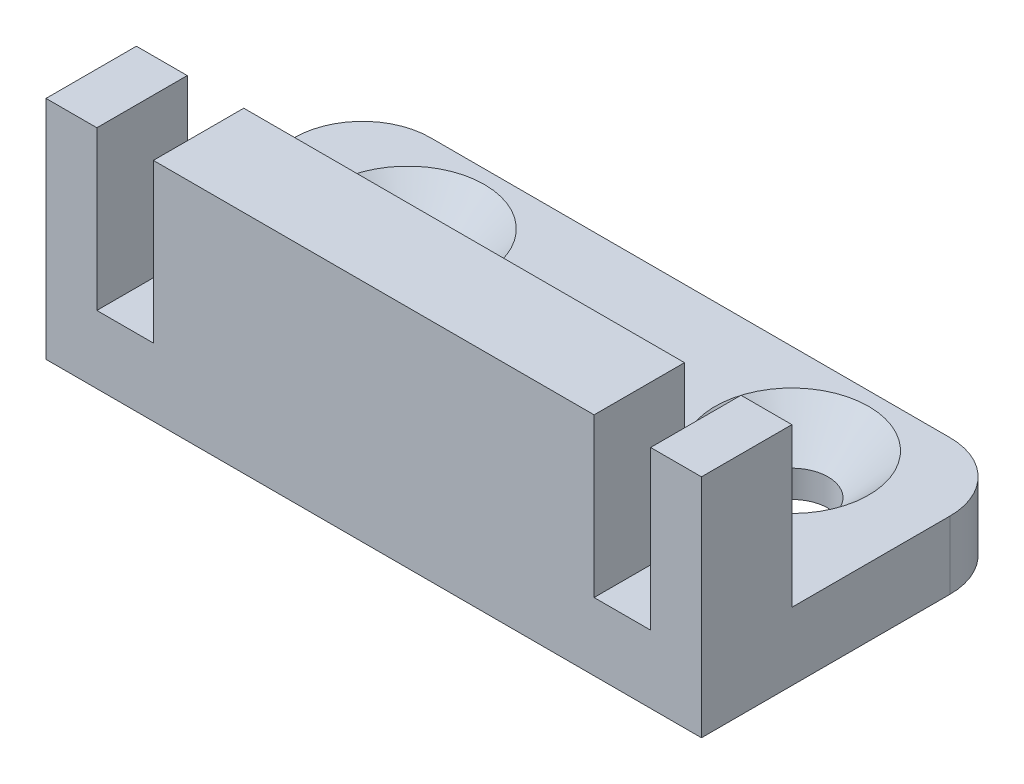
ISO-10303-21;
HEADER;
FILE_DESCRIPTION(('STEP AP214'),'2;1');
FILE_NAME('part.step','',(''),(''),'','','');
FILE_SCHEMA(('AUTOMOTIVE_DESIGN { 1 0 10303 214 1 1 1 1 }'));
ENDSEC;
DATA;
#1=APPLICATION_CONTEXT('core data for automotive mechanical design processes');
#2=APPLICATION_PROTOCOL_DEFINITION('international standard','automotive_design',2000,#1);
#3=PRODUCT_CONTEXT('',#1,'mechanical');
#4=PRODUCT('Part','Part','',(#3));
#5=PRODUCT_RELATED_PRODUCT_CATEGORY('part','',(#4));
#6=PRODUCT_DEFINITION_FORMATION('','',#4);
#7=PRODUCT_DEFINITION_CONTEXT('part definition',#1,'design');
#8=PRODUCT_DEFINITION('design','',#6,#7);
#9=PRODUCT_DEFINITION_SHAPE('','',#8);
#10=(LENGTH_UNIT() NAMED_UNIT(*) SI_UNIT(.MILLI.,.METRE.));
#11=(NAMED_UNIT(*) PLANE_ANGLE_UNIT() SI_UNIT($,.RADIAN.));
#12=(NAMED_UNIT(*) SI_UNIT($,.STERADIAN.) SOLID_ANGLE_UNIT());
#13=UNCERTAINTY_MEASURE_WITH_UNIT(LENGTH_MEASURE(1.E-05),#10,'distance_accuracy_value','');
#14=(GEOMETRIC_REPRESENTATION_CONTEXT(3) GLOBAL_UNCERTAINTY_ASSIGNED_CONTEXT((#13)) GLOBAL_UNIT_ASSIGNED_CONTEXT((#10,
#11,#12)) REPRESENTATION_CONTEXT('',''));
#15=CARTESIAN_POINT('',(0.,0.,0.));
#16=DIRECTION('',(0.,0.,1.));
#17=DIRECTION('',(1.,0.,0.));
#18=AXIS2_PLACEMENT_3D('',#15,#16,#17);
#19=CARTESIAN_POINT('',(0.,0.,-4.));
#20=DIRECTION('',(0.,0.,1.));
#21=DIRECTION('',(-1.,0.,0.));
#22=AXIS2_PLACEMENT_3D('',#19,#20,#21);
#23=PLANE('',#22);
#24=DIRECTION('',(-1.,0.,0.));
#25=VECTOR('',#24,1.);
#26=CARTESIAN_POINT('',(0.,3.,-4.));
#27=LINE('',#26,#25);
#28=CARTESIAN_POINT('',(2.25,3.,-4.));
#29=VERTEX_POINT('',#28);
#30=CARTESIAN_POINT('',(0.,3.,-4.));
#31=VERTEX_POINT('',#30);
#32=EDGE_CURVE('E152',#29,#31,#27,.T.);
#33=ORIENTED_EDGE('',*,*,#32,.T.);
#34=DIRECTION('',(0.,-1.,0.));
#35=VECTOR('',#34,1.);
#36=CARTESIAN_POINT('',(0.,0.,-4.));
#37=LINE('',#36,#35);
#38=CARTESIAN_POINT('',(0.,10.,-4.));
#39=VERTEX_POINT('',#38);
#40=EDGE_CURVE('E214',#39,#31,#37,.T.);
#41=ORIENTED_EDGE('',*,*,#40,.F.);
#42=DIRECTION('',(-1.,0.,0.));
#43=VECTOR('',#42,1.);
#44=CARTESIAN_POINT('',(0.,10.,-4.));
#45=LINE('',#44,#43);
#46=CARTESIAN_POINT('',(2.25,10.,-4.));
#47=VERTEX_POINT('',#46);
#48=EDGE_CURVE('E221',#47,#39,#45,.T.);
#49=ORIENTED_EDGE('',*,*,#48,.F.);
#50=DIRECTION('',(0.,1.,0.));
#51=VECTOR('',#50,1.);
#52=CARTESIAN_POINT('',(2.25,-1.7169905660283,-4.));
#53=LINE('',#52,#51);
#54=EDGE_CURVE('E157',#29,#47,#53,.T.);
#55=ORIENTED_EDGE('',*,*,#54,.F.);
#56=EDGE_LOOP('',(#33,#41,#49,#55));
#57=FACE_BOUND('',#56,.T.);
#58=ADVANCED_FACE('F35',(#57),#23,.F.);
#59=CARTESIAN_POINT('',(29.,10.,-4.));
#60=VERTEX_POINT('',#59);
#61=CARTESIAN_POINT('',(26.75,10.,-4.));
#62=VERTEX_POINT('',#61);
#63=EDGE_CURVE('E222',#60,#62,#45,.T.);
#64=ORIENTED_EDGE('',*,*,#63,.F.);
#65=DIRECTION('',(0.,1.,0.));
#66=VECTOR('',#65,1.);
#67=CARTESIAN_POINT('',(29.,0.,-4.));
#68=LINE('',#67,#66);
#69=CARTESIAN_POINT('',(29.,3.,-4.));
#70=VERTEX_POINT('',#69);
#71=EDGE_CURVE('E217',#70,#60,#68,.T.);
#72=ORIENTED_EDGE('',*,*,#71,.F.);
#73=CARTESIAN_POINT('',(26.75,3.,-4.));
#74=VERTEX_POINT('',#73);
#75=EDGE_CURVE('E204',#70,#74,#27,.T.);
#76=ORIENTED_EDGE('',*,*,#75,.T.);
#77=DIRECTION('',(0.,1.,0.));
#78=VECTOR('',#77,1.);
#79=CARTESIAN_POINT('',(26.75,-1.7169905660283,-4.));
#80=LINE('',#79,#78);
#81=EDGE_CURVE('E179',#74,#62,#80,.T.);
#82=ORIENTED_EDGE('',*,*,#81,.T.);
#83=EDGE_LOOP('',(#64,#72,#76,#82));
#84=FACE_BOUND('',#83,.T.);
#85=ADVANCED_FACE('F336',(#84),#23,.F.);
#86=CARTESIAN_POINT('',(0.,10.,-4.));
#87=DIRECTION('',(0.,-1.,0.));
#88=DIRECTION('',(0.,0.,1.));
#89=AXIS2_PLACEMENT_3D('',#86,#87,#88);
#90=PLANE('',#89);
#91=ORIENTED_EDGE('',*,*,#48,.T.);
#92=DIRECTION('',(0.,0.,1.));
#93=VECTOR('',#92,1.);
#94=CARTESIAN_POINT('',(0.,10.,-4.));
#95=LINE('',#94,#93);
#96=CARTESIAN_POINT('',(0.,10.,0.));
#97=VERTEX_POINT('',#96);
#98=EDGE_CURVE('E225',#39,#97,#95,.T.);
#99=ORIENTED_EDGE('',*,*,#98,.T.);
#100=DIRECTION('',(-1.,0.,0.));
#101=VECTOR('',#100,1.);
#102=CARTESIAN_POINT('',(0.,10.,0.));
#103=LINE('',#102,#101);
#104=CARTESIAN_POINT('',(2.25,10.,0.));
#105=VERTEX_POINT('',#104);
#106=EDGE_CURVE('E234',#105,#97,#103,.T.);
#107=ORIENTED_EDGE('',*,*,#106,.F.);
#108=DIRECTION('',(0.,0.,-1.));
#109=VECTOR('',#108,1.);
#110=CARTESIAN_POINT('',(2.25,10.,0.));
#111=LINE('',#110,#109);
#112=EDGE_CURVE('E166',#105,#47,#111,.T.);
#113=ORIENTED_EDGE('',*,*,#112,.T.);
#114=EDGE_LOOP('',(#91,#99,#107,#113));
#115=FACE_BOUND('',#114,.T.);
#116=ADVANCED_FACE('F341',(#115),#90,.F.);
#117=CARTESIAN_POINT('',(29.,10.,0.));
#118=VERTEX_POINT('',#117);
#119=CARTESIAN_POINT('',(26.75,10.,0.));
#120=VERTEX_POINT('',#119);
#121=EDGE_CURVE('E218',#118,#120,#103,.T.);
#122=ORIENTED_EDGE('',*,*,#121,.F.);
#123=DIRECTION('',(0.,0.,1.));
#124=VECTOR('',#123,1.);
#125=CARTESIAN_POINT('',(29.,10.,-4.));
#126=LINE('',#125,#124);
#127=EDGE_CURVE('E240',#60,#118,#126,.T.);
#128=ORIENTED_EDGE('',*,*,#127,.F.);
#129=ORIENTED_EDGE('',*,*,#63,.T.);
#130=DIRECTION('',(0.,0.,1.));
#131=VECTOR('',#130,1.);
#132=CARTESIAN_POINT('',(26.75,10.,0.));
#133=LINE('',#132,#131);
#134=EDGE_CURVE('E176',#62,#120,#133,.T.);
#135=ORIENTED_EDGE('',*,*,#134,.T.);
#136=EDGE_LOOP('',(#122,#128,#129,#135));
#137=FACE_BOUND('',#136,.T.);
#138=ADVANCED_FACE('F346',(#137),#90,.F.);
#139=CARTESIAN_POINT('',(24.25,10.,-4.));
#140=VERTEX_POINT('',#139);
#141=CARTESIAN_POINT('',(4.75,10.,-4.));
#142=VERTEX_POINT('',#141);
#143=EDGE_CURVE('E226',#140,#142,#45,.T.);
#144=ORIENTED_EDGE('',*,*,#143,.F.);
#145=DIRECTION('',(0.,1.,0.));
#146=VECTOR('',#145,1.);
#147=CARTESIAN_POINT('',(24.25,-1.7169905660283,-4.));
#148=LINE('',#147,#146);
#149=CARTESIAN_POINT('',(24.25,3.,-4.));
#150=VERTEX_POINT('',#149);
#151=EDGE_CURVE('E185',#150,#140,#148,.T.);
#152=ORIENTED_EDGE('',*,*,#151,.F.);
#153=CARTESIAN_POINT('',(4.75,3.,-4.));
#154=VERTEX_POINT('',#153);
#155=EDGE_CURVE('E209',#150,#154,#27,.T.);
#156=ORIENTED_EDGE('',*,*,#155,.T.);
#157=DIRECTION('',(0.,1.,0.));
#158=VECTOR('',#157,1.);
#159=CARTESIAN_POINT('',(4.75,-1.7169905660283,-4.));
#160=LINE('',#159,#158);
#161=EDGE_CURVE('E300',#154,#142,#160,.T.);
#162=ORIENTED_EDGE('',*,*,#161,.T.);
#163=EDGE_LOOP('',(#144,#152,#156,#162));
#164=FACE_BOUND('',#163,.T.);
#165=ADVANCED_FACE('F298',(#164),#23,.F.);
#166=CARTESIAN_POINT('',(0.,0.,-4.));
#167=DIRECTION('',(1.,0.,0.));
#168=DIRECTION('',(0.,0.,1.));
#169=AXIS2_PLACEMENT_3D('',#166,#167,#168);
#170=PLANE('',#169);
#171=DIRECTION('',(0.,0.,1.));
#172=VECTOR('',#171,1.);
#173=CARTESIAN_POINT('',(0.,0.,-4.));
#174=LINE('',#173,#172);
#175=CARTESIAN_POINT('',(0.,0.,-11.));
#176=VERTEX_POINT('',#175);
#177=CARTESIAN_POINT('',(0.,0.,0.));
#178=VERTEX_POINT('',#177);
#179=EDGE_CURVE('E246',#176,#178,#174,.T.);
#180=ORIENTED_EDGE('',*,*,#179,.T.);
#181=DIRECTION('',(0.,-1.,0.));
#182=VECTOR('',#181,1.);
#183=CARTESIAN_POINT('',(0.,0.,0.));
#184=LINE('',#183,#182);
#185=EDGE_CURVE('E213',#97,#178,#184,.T.);
#186=ORIENTED_EDGE('',*,*,#185,.F.);
#187=ORIENTED_EDGE('',*,*,#98,.F.);
#188=ORIENTED_EDGE('',*,*,#40,.T.);
#189=DIRECTION('',(0.,0.,1.));
#190=VECTOR('',#189,1.);
#191=CARTESIAN_POINT('',(0.,3.,-14.));
#192=LINE('',#191,#190);
#193=CARTESIAN_POINT('',(0.,3.,-11.));
#194=VERTEX_POINT('',#193);
#195=EDGE_CURVE('E206',#194,#31,#192,.T.);
#196=ORIENTED_EDGE('',*,*,#195,.F.);
#197=DIRECTION('',(0.,-1.,0.));
#198=VECTOR('',#197,1.);
#199=CARTESIAN_POINT('',(0.,0.,-11.));
#200=LINE('',#199,#198);
#201=EDGE_CURVE('E270',#176,#194,#200,.F.);
#202=ORIENTED_EDGE('',*,*,#201,.F.);
#203=EDGE_LOOP('',(#180,#186,#187,#188,#196,#202));
#204=FACE_BOUND('',#203,.T.);
#205=ADVANCED_FACE('F287',(#204),#170,.F.);
#206=CARTESIAN_POINT('',(0.,0.,-4.));
#207=DIRECTION('',(0.,1.,0.));
#208=DIRECTION('',(0.,0.,-1.));
#209=AXIS2_PLACEMENT_3D('',#206,#207,#208);
#210=PLANE('',#209);
#211=CARTESIAN_POINT('',(6.,0.,-10.));
#212=DIRECTION('',(0.,-1.,0.));
#213=DIRECTION('',(0.,0.,-1.));
#214=AXIS2_PLACEMENT_3D('',#211,#212,#213);
#215=CIRCLE('',#214,1.6);
#216=CARTESIAN_POINT('',(6.,0.,-11.6));
#217=VERTEX_POINT('',#216);
#218=EDGE_CURVE('E182',#217,#217,#215,.F.);
#219=ORIENTED_EDGE('',*,*,#218,.T.);
#220=EDGE_LOOP('',(#219));
#221=FACE_BOUND('',#220,.T.);
#222=CARTESIAN_POINT('',(23.,0.,-10.));
#223=DIRECTION('',(0.,-1.,0.));
#224=DIRECTION('',(0.,0.,-1.));
#225=AXIS2_PLACEMENT_3D('',#222,#223,#224);
#226=CIRCLE('',#225,1.6);
#227=CARTESIAN_POINT('',(23.,0.,-11.6));
#228=VERTEX_POINT('',#227);
#229=EDGE_CURVE('E311',#228,#228,#226,.F.);
#230=ORIENTED_EDGE('',*,*,#229,.T.);
#231=EDGE_LOOP('',(#230));
#232=FACE_BOUND('',#231,.T.);
#233=DIRECTION('',(1.,0.,0.));
#234=VECTOR('',#233,1.);
#235=CARTESIAN_POINT('',(0.,0.,-14.));
#236=LINE('',#235,#234);
#237=CARTESIAN_POINT('',(3.,0.,-14.));
#238=VERTEX_POINT('',#237);
#239=CARTESIAN_POINT('',(26.,0.,-14.));
#240=VERTEX_POINT('',#239);
#241=EDGE_CURVE('E200',#238,#240,#236,.T.);
#242=ORIENTED_EDGE('',*,*,#241,.T.);
#243=CARTESIAN_POINT('',(26.,0.,-11.));
#244=DIRECTION('',(0.,-1.,0.));
#245=DIRECTION('',(0.,0.,-1.));
#246=AXIS2_PLACEMENT_3D('',#243,#244,#245);
#247=CIRCLE('',#246,3.);
#248=CARTESIAN_POINT('',(29.,0.,-11.));
#249=VERTEX_POINT('',#248);
#250=EDGE_CURVE('E265',#249,#240,#247,.F.);
#251=ORIENTED_EDGE('',*,*,#250,.F.);
#252=DIRECTION('',(0.,0.,1.));
#253=VECTOR('',#252,1.);
#254=CARTESIAN_POINT('',(29.,0.,-4.));
#255=LINE('',#254,#253);
#256=CARTESIAN_POINT('',(29.,0.,0.));
#257=VERTEX_POINT('',#256);
#258=EDGE_CURVE('E243',#249,#257,#255,.T.);
#259=ORIENTED_EDGE('',*,*,#258,.T.);
#260=DIRECTION('',(1.,0.,0.));
#261=VECTOR('',#260,1.);
#262=CARTESIAN_POINT('',(0.,0.,0.));
#263=LINE('',#262,#261);
#264=EDGE_CURVE('E229',#178,#257,#263,.T.);
#265=ORIENTED_EDGE('',*,*,#264,.F.);
#266=ORIENTED_EDGE('',*,*,#179,.F.);
#267=CARTESIAN_POINT('',(3.,0.,-11.));
#268=DIRECTION('',(0.,-1.,0.));
#269=DIRECTION('',(0.,0.,-1.));
#270=AXIS2_PLACEMENT_3D('',#267,#268,#269);
#271=CIRCLE('',#270,3.);
#272=EDGE_CURVE('E268',#238,#176,#271,.F.);
#273=ORIENTED_EDGE('',*,*,#272,.F.);
#274=EDGE_LOOP('',(#242,#251,#259,#265,#266,#273));
#275=FACE_BOUND('',#274,.T.);
#276=ADVANCED_FACE('F284',(#221,#232,#275),#210,.F.);
#277=CARTESIAN_POINT('',(29.,0.,-4.));
#278=DIRECTION('',(-1.,0.,0.));
#279=DIRECTION('',(0.,0.,-1.));
#280=AXIS2_PLACEMENT_3D('',#277,#278,#279);
#281=PLANE('',#280);
#282=DIRECTION('',(0.,0.,1.));
#283=VECTOR('',#282,1.);
#284=CARTESIAN_POINT('',(29.,3.,-14.));
#285=LINE('',#284,#283);
#286=CARTESIAN_POINT('',(29.,3.,-11.));
#287=VERTEX_POINT('',#286);
#288=EDGE_CURVE('E211',#287,#70,#285,.T.);
#289=ORIENTED_EDGE('',*,*,#288,.T.);
#290=ORIENTED_EDGE('',*,*,#71,.T.);
#291=ORIENTED_EDGE('',*,*,#127,.T.);
#292=DIRECTION('',(0.,1.,0.));
#293=VECTOR('',#292,1.);
#294=CARTESIAN_POINT('',(29.,0.,0.));
#295=LINE('',#294,#293);
#296=EDGE_CURVE('E232',#257,#118,#295,.T.);
#297=ORIENTED_EDGE('',*,*,#296,.F.);
#298=ORIENTED_EDGE('',*,*,#258,.F.);
#299=DIRECTION('',(0.,1.,0.));
#300=VECTOR('',#299,1.);
#301=CARTESIAN_POINT('',(29.,0.,-11.));
#302=LINE('',#301,#300);
#303=EDGE_CURVE('E11',#287,#249,#302,.F.);
#304=ORIENTED_EDGE('',*,*,#303,.F.);
#305=EDGE_LOOP('',(#289,#290,#291,#297,#298,#304));
#306=FACE_BOUND('',#305,.T.);
#307=ADVANCED_FACE('F362',(#306),#281,.F.);
#308=CARTESIAN_POINT('',(24.25,10.,0.));
#309=VERTEX_POINT('',#308);
#310=CARTESIAN_POINT('',(4.75,10.,0.));
#311=VERTEX_POINT('',#310);
#312=EDGE_CURVE('E237',#309,#311,#103,.T.);
#313=ORIENTED_EDGE('',*,*,#312,.F.);
#314=DIRECTION('',(0.,0.,-1.));
#315=VECTOR('',#314,1.);
#316=CARTESIAN_POINT('',(24.25,10.,0.));
#317=LINE('',#316,#315);
#318=EDGE_CURVE('E180',#309,#140,#317,.T.);
#319=ORIENTED_EDGE('',*,*,#318,.T.);
#320=ORIENTED_EDGE('',*,*,#143,.T.);
#321=DIRECTION('',(0.,0.,1.));
#322=VECTOR('',#321,1.);
#323=CARTESIAN_POINT('',(4.75,10.,0.));
#324=LINE('',#323,#322);
#325=EDGE_CURVE('E199',#142,#311,#324,.T.);
#326=ORIENTED_EDGE('',*,*,#325,.T.);
#327=EDGE_LOOP('',(#313,#319,#320,#326));
#328=FACE_BOUND('',#327,.T.);
#329=ADVANCED_FACE('F354',(#328),#90,.F.);
#330=CARTESIAN_POINT('',(0.,0.,0.));
#331=DIRECTION('',(0.,0.,1.));
#332=DIRECTION('',(-1.,0.,0.));
#333=AXIS2_PLACEMENT_3D('',#330,#331,#332);
#334=PLANE('',#333);
#335=DIRECTION('',(0.,1.,0.));
#336=VECTOR('',#335,1.);
#337=CARTESIAN_POINT('',(2.25,-1.7169905660283,0.));
#338=LINE('',#337,#336);
#339=CARTESIAN_POINT('',(2.25,3.,0.));
#340=VERTEX_POINT('',#339);
#341=EDGE_CURVE('E158',#340,#105,#338,.T.);
#342=ORIENTED_EDGE('',*,*,#341,.T.);
#343=ORIENTED_EDGE('',*,*,#106,.T.);
#344=ORIENTED_EDGE('',*,*,#185,.T.);
#345=ORIENTED_EDGE('',*,*,#264,.T.);
#346=ORIENTED_EDGE('',*,*,#296,.T.);
#347=ORIENTED_EDGE('',*,*,#121,.T.);
#348=DIRECTION('',(0.,1.,0.));
#349=VECTOR('',#348,1.);
#350=CARTESIAN_POINT('',(26.75,-1.7169905660283,0.));
#351=LINE('',#350,#349);
#352=CARTESIAN_POINT('',(26.75,3.,0.));
#353=VERTEX_POINT('',#352);
#354=EDGE_CURVE('E190',#353,#120,#351,.T.);
#355=ORIENTED_EDGE('',*,*,#354,.F.);
#356=DIRECTION('',(-1.,0.,0.));
#357=VECTOR('',#356,1.);
#358=CARTESIAN_POINT('',(24.25,3.,0.));
#359=LINE('',#358,#357);
#360=CARTESIAN_POINT('',(24.25,3.,0.));
#361=VERTEX_POINT('',#360);
#362=EDGE_CURVE('E187',#353,#361,#359,.T.);
#363=ORIENTED_EDGE('',*,*,#362,.T.);
#364=DIRECTION('',(0.,1.,0.));
#365=VECTOR('',#364,1.);
#366=CARTESIAN_POINT('',(24.25,-1.7169905660283,0.));
#367=LINE('',#366,#365);
#368=EDGE_CURVE('E186',#361,#309,#367,.T.);
#369=ORIENTED_EDGE('',*,*,#368,.T.);
#370=ORIENTED_EDGE('',*,*,#312,.T.);
#371=DIRECTION('',(0.,1.,0.));
#372=VECTOR('',#371,1.);
#373=CARTESIAN_POINT('',(4.75,-1.7169905660283,0.));
#374=LINE('',#373,#372);
#375=CARTESIAN_POINT('',(4.75,3.,0.));
#376=VERTEX_POINT('',#375);
#377=EDGE_CURVE('E165',#376,#311,#374,.T.);
#378=ORIENTED_EDGE('',*,*,#377,.F.);
#379=DIRECTION('',(-1.,0.,0.));
#380=VECTOR('',#379,1.);
#381=CARTESIAN_POINT('',(4.75,3.,0.));
#382=LINE('',#381,#380);
#383=EDGE_CURVE('E149',#376,#340,#382,.T.);
#384=ORIENTED_EDGE('',*,*,#383,.T.);
#385=EDGE_LOOP('',(#342,#343,#344,#345,#346,#347,#355,#363,#369,#370,#378,#384));
#386=FACE_BOUND('',#385,.T.);
#387=ADVANCED_FACE('F161',(#386),#334,.T.);
#388=CARTESIAN_POINT('',(0.,3.,-14.));
#389=DIRECTION('',(0.,-1.,0.));
#390=DIRECTION('',(0.,0.,1.));
#391=AXIS2_PLACEMENT_3D('',#388,#389,#390);
#392=PLANE('',#391);
#393=CARTESIAN_POINT('',(23.,3.,-10.));
#394=DIRECTION('',(0.,1.,0.));
#395=DIRECTION('',(0.,0.,1.));
#396=AXIS2_PLACEMENT_3D('',#393,#394,#395);
#397=CIRCLE('',#396,3.40000000000002);
#398=CARTESIAN_POINT('',(23.,3.,-13.4));
#399=VERTEX_POINT('',#398);
#400=EDGE_CURVE('E255',#399,#399,#397,.T.);
#401=ORIENTED_EDGE('',*,*,#400,.F.);
#402=EDGE_LOOP('',(#401));
#403=FACE_BOUND('',#402,.T.);
#404=CARTESIAN_POINT('',(6.,3.,-10.));
#405=DIRECTION('',(0.,1.,0.));
#406=DIRECTION('',(0.,0.,1.));
#407=AXIS2_PLACEMENT_3D('',#404,#405,#406);
#408=CIRCLE('',#407,3.40000000000002);
#409=CARTESIAN_POINT('',(6.,3.,-6.59999999999998));
#410=VERTEX_POINT('',#409);
#411=EDGE_CURVE('E252',#410,#410,#408,.T.);
#412=ORIENTED_EDGE('',*,*,#411,.F.);
#413=EDGE_LOOP('',(#412));
#414=FACE_BOUND('',#413,.T.);
#415=ORIENTED_EDGE('',*,*,#195,.T.);
#416=ORIENTED_EDGE('',*,*,#32,.F.);
#417=DIRECTION('',(0.,0.,-1.));
#418=VECTOR('',#417,1.);
#419=CARTESIAN_POINT('',(2.25,3.,0.));
#420=LINE('',#419,#418);
#421=EDGE_CURVE('E146',#340,#29,#420,.T.);
#422=ORIENTED_EDGE('',*,*,#421,.F.);
#423=ORIENTED_EDGE('',*,*,#383,.F.);
#424=DIRECTION('',(0.,0.,1.));
#425=VECTOR('',#424,1.);
#426=CARTESIAN_POINT('',(4.75,3.,0.));
#427=LINE('',#426,#425);
#428=EDGE_CURVE('E175',#154,#376,#427,.T.);
#429=ORIENTED_EDGE('',*,*,#428,.F.);
#430=ORIENTED_EDGE('',*,*,#155,.F.);
#431=DIRECTION('',(0.,0.,-1.));
#432=VECTOR('',#431,1.);
#433=CARTESIAN_POINT('',(24.25,3.,0.));
#434=LINE('',#433,#432);
#435=EDGE_CURVE('E183',#361,#150,#434,.T.);
#436=ORIENTED_EDGE('',*,*,#435,.F.);
#437=ORIENTED_EDGE('',*,*,#362,.F.);
#438=DIRECTION('',(0.,0.,1.));
#439=VECTOR('',#438,1.);
#440=CARTESIAN_POINT('',(26.75,3.,0.));
#441=LINE('',#440,#439);
#442=EDGE_CURVE('E191',#74,#353,#441,.T.);
#443=ORIENTED_EDGE('',*,*,#442,.F.);
#444=ORIENTED_EDGE('',*,*,#75,.F.);
#445=ORIENTED_EDGE('',*,*,#288,.F.);
#446=CARTESIAN_POINT('',(26.,3.,-11.));
#447=DIRECTION('',(0.,1.,0.));
#448=DIRECTION('',(0.,0.,1.));
#449=AXIS2_PLACEMENT_3D('',#446,#447,#448);
#450=CIRCLE('',#449,3.);
#451=CARTESIAN_POINT('',(26.,3.,-14.));
#452=VERTEX_POINT('',#451);
#453=EDGE_CURVE('E49',#452,#287,#450,.F.);
#454=ORIENTED_EDGE('',*,*,#453,.F.);
#455=DIRECTION('',(-1.,0.,0.));
#456=VECTOR('',#455,1.);
#457=CARTESIAN_POINT('',(0.,3.,-14.));
#458=LINE('',#457,#456);
#459=CARTESIAN_POINT('',(3.,3.,-14.));
#460=VERTEX_POINT('',#459);
#461=EDGE_CURVE('E203',#452,#460,#458,.T.);
#462=ORIENTED_EDGE('',*,*,#461,.T.);
#463=CARTESIAN_POINT('',(3.,3.,-11.));
#464=DIRECTION('',(0.,1.,0.));
#465=DIRECTION('',(0.,0.,1.));
#466=AXIS2_PLACEMENT_3D('',#463,#464,#465);
#467=CIRCLE('',#466,3.);
#468=EDGE_CURVE('E43',#194,#460,#467,.F.);
#469=ORIENTED_EDGE('',*,*,#468,.F.);
#470=EDGE_LOOP('',(#415,#416,#422,#423,#429,#430,#436,#437,#443,#444,#445,#454,#462,#469));
#471=FACE_BOUND('',#470,.T.);
#472=ADVANCED_FACE('F148',(#403,#414,#471),#392,.F.);
#473=CARTESIAN_POINT('',(0.,0.,-14.));
#474=DIRECTION('',(0.,0.,1.));
#475=DIRECTION('',(-1.,0.,0.));
#476=AXIS2_PLACEMENT_3D('',#473,#474,#475);
#477=PLANE('',#476);
#478=ORIENTED_EDGE('',*,*,#461,.F.);
#479=DIRECTION('',(0.,1.,0.));
#480=VECTOR('',#479,1.);
#481=CARTESIAN_POINT('',(26.,0.,-14.));
#482=LINE('',#481,#480);
#483=EDGE_CURVE('E261',#240,#452,#482,.T.);
#484=ORIENTED_EDGE('',*,*,#483,.F.);
#485=ORIENTED_EDGE('',*,*,#241,.F.);
#486=DIRECTION('',(0.,-1.,0.));
#487=VECTOR('',#486,1.);
#488=CARTESIAN_POINT('',(3.,0.,-14.));
#489=LINE('',#488,#487);
#490=EDGE_CURVE('E263',#460,#238,#489,.T.);
#491=ORIENTED_EDGE('',*,*,#490,.F.);
#492=EDGE_LOOP('',(#478,#484,#485,#491));
#493=FACE_BOUND('',#492,.T.);
#494=ADVANCED_FACE('F280',(#493),#477,.F.);
#495=CARTESIAN_POINT('',(26.75,-1.7169905660283,0.));
#496=DIRECTION('',(1.,0.,0.));
#497=DIRECTION('',(0.,0.,1.));
#498=AXIS2_PLACEMENT_3D('',#495,#496,#497);
#499=PLANE('',#498);
#500=ORIENTED_EDGE('',*,*,#81,.F.);
#501=ORIENTED_EDGE('',*,*,#442,.T.);
#502=ORIENTED_EDGE('',*,*,#354,.T.);
#503=ORIENTED_EDGE('',*,*,#134,.F.);
#504=EDGE_LOOP('',(#500,#501,#502,#503));
#505=FACE_BOUND('',#504,.T.);
#506=ADVANCED_FACE('F377',(#505),#499,.F.);
#507=CARTESIAN_POINT('',(24.25,-1.7169905660283,0.));
#508=DIRECTION('',(-1.,0.,0.));
#509=DIRECTION('',(0.,0.,-1.));
#510=AXIS2_PLACEMENT_3D('',#507,#508,#509);
#511=PLANE('',#510);
#512=ORIENTED_EDGE('',*,*,#368,.F.);
#513=ORIENTED_EDGE('',*,*,#435,.T.);
#514=ORIENTED_EDGE('',*,*,#151,.T.);
#515=ORIENTED_EDGE('',*,*,#318,.F.);
#516=EDGE_LOOP('',(#512,#513,#514,#515));
#517=FACE_BOUND('',#516,.T.);
#518=ADVANCED_FACE('F380',(#517),#511,.F.);
#519=CARTESIAN_POINT('',(2.25,-1.7169905660283,0.));
#520=DIRECTION('',(-1.,0.,0.));
#521=DIRECTION('',(0.,0.,-1.));
#522=AXIS2_PLACEMENT_3D('',#519,#520,#521);
#523=PLANE('',#522);
#524=ORIENTED_EDGE('',*,*,#341,.F.);
#525=ORIENTED_EDGE('',*,*,#421,.T.);
#526=ORIENTED_EDGE('',*,*,#54,.T.);
#527=ORIENTED_EDGE('',*,*,#112,.F.);
#528=EDGE_LOOP('',(#524,#525,#526,#527));
#529=FACE_BOUND('',#528,.T.);
#530=ADVANCED_FACE('F168',(#529),#523,.F.);
#531=CARTESIAN_POINT('',(4.75,-1.7169905660283,0.));
#532=DIRECTION('',(1.,0.,0.));
#533=DIRECTION('',(0.,0.,1.));
#534=AXIS2_PLACEMENT_3D('',#531,#532,#533);
#535=PLANE('',#534);
#536=ORIENTED_EDGE('',*,*,#161,.F.);
#537=ORIENTED_EDGE('',*,*,#428,.T.);
#538=ORIENTED_EDGE('',*,*,#377,.T.);
#539=ORIENTED_EDGE('',*,*,#325,.F.);
#540=EDGE_LOOP('',(#536,#537,#538,#539));
#541=FACE_BOUND('',#540,.T.);
#542=ADVANCED_FACE('F306',(#541),#535,.F.);
#543=CARTESIAN_POINT('',(23.,-0.00100000000000013,-10.));
#544=DIRECTION('',(0.,1.,0.));
#545=DIRECTION('',(0.,0.,-1.));
#546=AXIS2_PLACEMENT_3D('',#543,#544,#545);
#547=CYLINDRICAL_SURFACE('',#546,1.6);
#548=CARTESIAN_POINT('',(23.,1.19999999999998,-10.));
#549=DIRECTION('',(0.,1.,0.));
#550=DIRECTION('',(0.,0.,1.));
#551=AXIS2_PLACEMENT_3D('',#548,#549,#550);
#552=CIRCLE('',#551,1.6);
#553=CARTESIAN_POINT('',(23.,1.19999999999998,-11.6));
#554=VERTEX_POINT('',#553);
#555=EDGE_CURVE('E249',#554,#554,#552,.F.);
#556=CARTESIAN_POINT('',(23.,1.19999999999998,-11.6));
#557=CARTESIAN_POINT('',(23.,1.18749999999998,-11.6));
#558=CARTESIAN_POINT('',(23.,1.17499999999998,-11.6));
#559=CARTESIAN_POINT('',(23.,1.14999999999998,-11.6));
#560=CARTESIAN_POINT('',(23.,1.13749999999998,-11.6));
#561=CARTESIAN_POINT('',(23.,1.11249999999998,-11.6));
#562=CARTESIAN_POINT('',(23.,1.09999999999998,-11.6));
#563=CARTESIAN_POINT('',(23.,1.07499999999998,-11.6));
#564=CARTESIAN_POINT('',(23.,1.06249999999998,-11.6));
#565=CARTESIAN_POINT('',(23.,1.03749999999999,-11.6));
#566=CARTESIAN_POINT('',(23.,1.02499999999999,-11.6));
#567=CARTESIAN_POINT('',(23.,0.999999999999986,-11.6));
#568=CARTESIAN_POINT('',(23.,0.987499999999986,-11.6));
#569=CARTESIAN_POINT('',(23.,0.962499999999986,-11.6));
#570=CARTESIAN_POINT('',(23.,0.949999999999987,-11.6));
#571=CARTESIAN_POINT('',(23.,0.924999999999987,-11.6));
#572=CARTESIAN_POINT('',(23.,0.912499999999987,-11.6));
#573=CARTESIAN_POINT('',(23.,0.887499999999988,-11.6));
#574=CARTESIAN_POINT('',(23.,0.874999999999988,-11.6));
#575=CARTESIAN_POINT('',(23.,0.849999999999988,-11.6));
#576=CARTESIAN_POINT('',(23.,0.837499999999988,-11.6));
#577=CARTESIAN_POINT('',(23.,0.812499999999989,-11.6));
#578=CARTESIAN_POINT('',(23.,0.799999999999989,-11.6));
#579=CARTESIAN_POINT('',(23.,0.774999999999989,-11.6));
#580=CARTESIAN_POINT('',(23.,0.762499999999989,-11.6));
#581=CARTESIAN_POINT('',(23.,0.73749999999999,-11.6));
#582=CARTESIAN_POINT('',(23.,0.72499999999999,-11.6));
#583=CARTESIAN_POINT('',(23.,0.69999999999999,-11.6));
#584=CARTESIAN_POINT('',(23.,0.68749999999999,-11.6));
#585=CARTESIAN_POINT('',(23.,0.662499999999991,-11.6));
#586=CARTESIAN_POINT('',(23.,0.649999999999991,-11.6));
#587=CARTESIAN_POINT('',(23.,0.624999999999991,-11.6));
#588=CARTESIAN_POINT('',(23.,0.612499999999991,-11.6));
#589=CARTESIAN_POINT('',(23.,0.587499999999992,-11.6));
#590=CARTESIAN_POINT('',(23.,0.574999999999992,-11.6));
#591=CARTESIAN_POINT('',(23.,0.549999999999992,-11.6));
#592=CARTESIAN_POINT('',(23.,0.537499999999992,-11.6));
#593=CARTESIAN_POINT('',(23.,0.512499999999993,-11.6));
#594=CARTESIAN_POINT('',(23.,0.499999999999993,-11.6));
#595=CARTESIAN_POINT('',(23.,0.474999999999993,-11.6));
#596=CARTESIAN_POINT('',(23.,0.462499999999993,-11.6));
#597=CARTESIAN_POINT('',(23.,0.437499999999994,-11.6));
#598=CARTESIAN_POINT('',(23.,0.424999999999994,-11.6));
#599=CARTESIAN_POINT('',(23.,0.399999999999994,-11.6));
#600=CARTESIAN_POINT('',(23.,0.387499999999995,-11.6));
#601=CARTESIAN_POINT('',(23.,0.362499999999995,-11.6));
#602=CARTESIAN_POINT('',(23.,0.349999999999995,-11.6));
#603=CARTESIAN_POINT('',(23.,0.324999999999995,-11.6));
#604=CARTESIAN_POINT('',(23.,0.312499999999996,-11.6));
#605=CARTESIAN_POINT('',(23.,0.287499999999996,-11.6));
#606=CARTESIAN_POINT('',(23.,0.274999999999996,-11.6));
#607=CARTESIAN_POINT('',(23.,0.249999999999996,-11.6));
#608=CARTESIAN_POINT('',(23.,0.237499999999997,-11.6));
#609=CARTESIAN_POINT('',(23.,0.212499999999997,-11.6));
#610=CARTESIAN_POINT('',(23.,0.199999999999997,-11.6));
#611=CARTESIAN_POINT('',(23.,0.174999999999997,-11.6));
#612=CARTESIAN_POINT('',(23.,0.162499999999998,-11.6));
#613=CARTESIAN_POINT('',(23.,0.137499999999998,-11.6));
#614=CARTESIAN_POINT('',(23.,0.124999999999998,-11.6));
#615=CARTESIAN_POINT('',(23.,0.0999999999999986,-11.6));
#616=CARTESIAN_POINT('',(23.,0.0874999999999987,-11.6));
#617=CARTESIAN_POINT('',(23.,0.0624999999999991,-11.6));
#618=CARTESIAN_POINT('',(23.,0.0499999999999993,-11.6));
#619=CARTESIAN_POINT('',(23.,0.0249999999999997,-11.6));
#620=CARTESIAN_POINT('',(23.,0.0124999999999999,-11.6));
#621=CARTESIAN_POINT('',(23.,0.,-11.6));
#622=B_SPLINE_CURVE_WITH_KNOTS('',3,(#556,#557,#558,#559,#560,#561,#562,#563,#564,#565,#566,
#567,#568,#569,#570,#571,#572,#573,#574,#575,#576,#577,#578,#579,#580,#581,#582,#583,#584,#585,
#586,#587,#588,#589,#590,#591,#592,#593,#594,#595,#596,#597,#598,#599,#600,#601,#602,#603,#604,
#605,#606,#607,#608,#609,#610,#611,#612,#613,#614,#615,#616,#617,#618,#619,#620,#621),
.UNSPECIFIED.,.F.,.F.,(4,2,2,2,2,2,2,2,2,2,2,2,2,2,2,2,2,2,2,2,2,2,2,2,2,2,2,2,2,2,2,2,4),(0.,
0.0374999999999996,0.0749999999999989,0.112499999999998,0.149999999999998,0.187499999999997,
0.224999999999997,0.262499999999996,0.299999999999996,0.337499999999995,0.374999999999995,
0.412499999999994,0.449999999999994,0.487499999999993,0.524999999999993,0.562499999999992,
0.599999999999992,0.637499999999991,0.67499999999999,0.71249999999999,0.749999999999989,
0.787499999999989,0.824999999999988,0.862499999999988,0.899999999999987,0.937499999999987,
0.974999999999986,1.01249999999999,1.04999999999999,1.08749999999998,1.12499999999998,
1.16249999999998,1.19999999999998),.UNSPECIFIED.);
#623=EDGE_CURVE('BSEAM322',#554,#228,#622,.T.);
#624=ORIENTED_EDGE('',*,*,#555,.F.);
#625=ORIENTED_EDGE('',*,*,#229,.F.);
#626=ORIENTED_EDGE('',*,*,#623,.T.);
#627=ORIENTED_EDGE('',*,*,#623,.F.);
#628=EDGE_LOOP('',(#624,#626,#625,#627));
#629=FACE_BOUND('',#628,.T.);
#630=ADVANCED_FACE('F322',(#629),#547,.F.);
#631=CARTESIAN_POINT('',(6.,-0.00100000000000013,-10.));
#632=DIRECTION('',(0.,1.,0.));
#633=DIRECTION('',(0.,0.,-1.));
#634=AXIS2_PLACEMENT_3D('',#631,#632,#633);
#635=CYLINDRICAL_SURFACE('',#634,1.6);
#636=CARTESIAN_POINT('',(6.,1.19999999999998,-10.));
#637=DIRECTION('',(0.,1.,0.));
#638=DIRECTION('',(0.,0.,1.));
#639=AXIS2_PLACEMENT_3D('',#636,#637,#638);
#640=CIRCLE('',#639,1.6);
#641=CARTESIAN_POINT('',(6.,1.19999999999998,-11.6));
#642=VERTEX_POINT('',#641);
#643=EDGE_CURVE('E258',#642,#642,#640,.F.);
#644=CARTESIAN_POINT('',(6.,1.19999999999998,-11.6));
#645=CARTESIAN_POINT('',(6.,1.18749999999998,-11.6));
#646=CARTESIAN_POINT('',(6.,1.17499999999998,-11.6));
#647=CARTESIAN_POINT('',(6.,1.14999999999998,-11.6));
#648=CARTESIAN_POINT('',(6.,1.13749999999998,-11.6));
#649=CARTESIAN_POINT('',(6.,1.11249999999998,-11.6));
#650=CARTESIAN_POINT('',(6.,1.09999999999998,-11.6));
#651=CARTESIAN_POINT('',(6.,1.07499999999998,-11.6));
#652=CARTESIAN_POINT('',(6.,1.06249999999998,-11.6));
#653=CARTESIAN_POINT('',(6.,1.03749999999998,-11.6));
#654=CARTESIAN_POINT('',(6.,1.02499999999998,-11.6));
#655=CARTESIAN_POINT('',(6.,0.999999999999984,-11.6));
#656=CARTESIAN_POINT('',(6.,0.987499999999985,-11.6));
#657=CARTESIAN_POINT('',(6.,0.962499999999985,-11.6));
#658=CARTESIAN_POINT('',(6.,0.949999999999985,-11.6));
#659=CARTESIAN_POINT('',(6.,0.924999999999986,-11.6));
#660=CARTESIAN_POINT('',(6.,0.912499999999986,-11.6));
#661=CARTESIAN_POINT('',(6.,0.887499999999986,-11.6));
#662=CARTESIAN_POINT('',(6.,0.874999999999986,-11.6));
#663=CARTESIAN_POINT('',(6.,0.849999999999987,-11.6));
#664=CARTESIAN_POINT('',(6.,0.837499999999987,-11.6));
#665=CARTESIAN_POINT('',(6.,0.812499999999987,-11.6));
#666=CARTESIAN_POINT('',(6.,0.799999999999988,-11.6));
#667=CARTESIAN_POINT('',(6.,0.774999999999988,-11.6));
#668=CARTESIAN_POINT('',(6.,0.762499999999988,-11.6));
#669=CARTESIAN_POINT('',(6.,0.737499999999988,-11.6));
#670=CARTESIAN_POINT('',(6.,0.724999999999989,-11.6));
#671=CARTESIAN_POINT('',(6.,0.699999999999989,-11.6));
#672=CARTESIAN_POINT('',(6.,0.687499999999989,-11.6));
#673=CARTESIAN_POINT('',(6.,0.66249999999999,-11.6));
#674=CARTESIAN_POINT('',(6.,0.64999999999999,-11.6));
#675=CARTESIAN_POINT('',(6.,0.62499999999999,-11.6));
#676=CARTESIAN_POINT('',(6.,0.61249999999999,-11.6));
#677=CARTESIAN_POINT('',(6.,0.587499999999991,-11.6));
#678=CARTESIAN_POINT('',(6.,0.574999999999991,-11.6));
#679=CARTESIAN_POINT('',(6.,0.549999999999991,-11.6));
#680=CARTESIAN_POINT('',(6.,0.537499999999992,-11.6));
#681=CARTESIAN_POINT('',(6.,0.512499999999992,-11.6));
#682=CARTESIAN_POINT('',(6.,0.499999999999992,-11.6));
#683=CARTESIAN_POINT('',(6.,0.474999999999993,-11.6));
#684=CARTESIAN_POINT('',(6.,0.462499999999993,-11.6));
#685=CARTESIAN_POINT('',(6.,0.437499999999993,-11.6));
#686=CARTESIAN_POINT('',(6.,0.424999999999993,-11.6));
#687=CARTESIAN_POINT('',(6.,0.399999999999994,-11.6));
#688=CARTESIAN_POINT('',(6.,0.387499999999994,-11.6));
#689=CARTESIAN_POINT('',(6.,0.362499999999994,-11.6));
#690=CARTESIAN_POINT('',(6.,0.349999999999995,-11.6));
#691=CARTESIAN_POINT('',(6.,0.324999999999995,-11.6));
#692=CARTESIAN_POINT('',(6.,0.312499999999995,-11.6));
#693=CARTESIAN_POINT('',(6.,0.287499999999995,-11.6));
#694=CARTESIAN_POINT('',(6.,0.274999999999996,-11.6));
#695=CARTESIAN_POINT('',(6.,0.249999999999996,-11.6));
#696=CARTESIAN_POINT('',(6.,0.237499999999996,-11.6));
#697=CARTESIAN_POINT('',(6.,0.212499999999997,-11.6));
#698=CARTESIAN_POINT('',(6.,0.199999999999997,-11.6));
#699=CARTESIAN_POINT('',(6.,0.174999999999997,-11.6));
#700=CARTESIAN_POINT('',(6.,0.162499999999998,-11.6));
#701=CARTESIAN_POINT('',(6.,0.137499999999998,-11.6));
#702=CARTESIAN_POINT('',(6.,0.124999999999998,-11.6));
#703=CARTESIAN_POINT('',(6.,0.0999999999999985,-11.6));
#704=CARTESIAN_POINT('',(6.,0.0874999999999987,-11.6));
#705=CARTESIAN_POINT('',(6.,0.062499999999999,-11.6));
#706=CARTESIAN_POINT('',(6.,0.0499999999999992,-11.6));
#707=CARTESIAN_POINT('',(6.,0.0249999999999996,-11.6));
#708=CARTESIAN_POINT('',(6.,0.0124999999999998,-11.6));
#709=CARTESIAN_POINT('',(6.,0.,-11.6));
#710=B_SPLINE_CURVE_WITH_KNOTS('',3,(#644,#645,#646,#647,#648,#649,#650,#651,#652,#653,#654,
#655,#656,#657,#658,#659,#660,#661,#662,#663,#664,#665,#666,#667,#668,#669,#670,#671,#672,#673,
#674,#675,#676,#677,#678,#679,#680,#681,#682,#683,#684,#685,#686,#687,#688,#689,#690,#691,#692,
#693,#694,#695,#696,#697,#698,#699,#700,#701,#702,#703,#704,#705,#706,#707,#708,#709),
.UNSPECIFIED.,.F.,.F.,(4,2,2,2,2,2,2,2,2,2,2,2,2,2,2,2,2,2,2,2,2,2,2,2,2,2,2,2,2,2,2,2,4),(0.,
0.0374999999999993,0.0749999999999989,0.112499999999998,0.149999999999998,0.187499999999997,
0.224999999999996,0.262499999999996,0.299999999999995,0.337499999999995,0.374999999999994,
0.412499999999993,0.449999999999993,0.487499999999992,0.524999999999992,0.562499999999991,
0.599999999999991,0.63749999999999,0.674999999999989,0.712499999999989,0.749999999999988,
0.787499999999988,0.824999999999987,0.862499999999986,0.899999999999986,0.937499999999985,
0.974999999999985,1.01249999999998,1.04999999999998,1.08749999999998,1.12499999999998,
1.16249999999998,1.19999999999998),.UNSPECIFIED.);
#711=EDGE_CURVE('BSEAM319',#642,#217,#710,.T.);
#712=ORIENTED_EDGE('',*,*,#643,.F.);
#713=ORIENTED_EDGE('',*,*,#218,.F.);
#714=ORIENTED_EDGE('',*,*,#711,.T.);
#715=ORIENTED_EDGE('',*,*,#711,.F.);
#716=EDGE_LOOP('',(#712,#714,#713,#715));
#717=FACE_BOUND('',#716,.T.);
#718=ADVANCED_FACE('F319',(#717),#635,.F.);
#719=CARTESIAN_POINT('',(23.,1.19999999999998,-10.));
#720=DIRECTION('',(0.,1.,0.));
#721=DIRECTION('',(0.,0.,-1.));
#722=AXIS2_PLACEMENT_3D('',#719,#720,#721);
#723=CONICAL_SURFACE('',#722,1.6,0.78539816339745);
#724=CARTESIAN_POINT('',(23.,3.,-13.4));
#725=CARTESIAN_POINT('',(23.,2.98125,-13.38125));
#726=CARTESIAN_POINT('',(23.,2.9625,-13.3625));
#727=CARTESIAN_POINT('',(23.,2.925,-13.325));
#728=CARTESIAN_POINT('',(23.,2.90625,-13.30625));
#729=CARTESIAN_POINT('',(23.,2.86875,-13.26875));
#730=CARTESIAN_POINT('',(23.,2.85,-13.25));
#731=CARTESIAN_POINT('',(23.,2.8125,-13.2125));
#732=CARTESIAN_POINT('',(23.,2.79375,-13.19375));
#733=CARTESIAN_POINT('',(23.,2.75625,-13.15625));
#734=CARTESIAN_POINT('',(23.,2.7375,-13.1375));
#735=CARTESIAN_POINT('',(23.,2.7,-13.1));
#736=CARTESIAN_POINT('',(23.,2.68125,-13.08125));
#737=CARTESIAN_POINT('',(23.,2.64375,-13.04375));
#738=CARTESIAN_POINT('',(23.,2.625,-13.025));
#739=CARTESIAN_POINT('',(23.,2.5875,-12.9875));
#740=CARTESIAN_POINT('',(23.,2.56875,-12.96875));
#741=CARTESIAN_POINT('',(23.,2.53125,-12.93125));
#742=CARTESIAN_POINT('',(23.,2.5125,-12.9125));
#743=CARTESIAN_POINT('',(23.,2.475,-12.875));
#744=CARTESIAN_POINT('',(23.,2.45624999999999,-12.85625));
#745=CARTESIAN_POINT('',(23.,2.41874999999999,-12.81875));
#746=CARTESIAN_POINT('',(23.,2.39999999999999,-12.8));
#747=CARTESIAN_POINT('',(23.,2.36249999999999,-12.7625));
#748=CARTESIAN_POINT('',(23.,2.34374999999999,-12.74375));
#749=CARTESIAN_POINT('',(23.,2.30624999999999,-12.70625));
#750=CARTESIAN_POINT('',(23.,2.28749999999999,-12.6875));
#751=CARTESIAN_POINT('',(23.,2.24999999999999,-12.65));
#752=CARTESIAN_POINT('',(23.,2.23124999999999,-12.63125));
#753=CARTESIAN_POINT('',(23.,2.19374999999999,-12.59375));
#754=CARTESIAN_POINT('',(23.,2.17499999999999,-12.575));
#755=CARTESIAN_POINT('',(23.,2.13749999999999,-12.5375));
#756=CARTESIAN_POINT('',(23.,2.11874999999999,-12.51875));
#757=CARTESIAN_POINT('',(23.,2.08124999999999,-12.48125));
#758=CARTESIAN_POINT('',(23.,2.06249999999999,-12.4625));
#759=CARTESIAN_POINT('',(23.,2.02499999999999,-12.425));
#760=CARTESIAN_POINT('',(23.,2.00624999999999,-12.40625));
#761=CARTESIAN_POINT('',(23.,1.96874999999999,-12.36875));
#762=CARTESIAN_POINT('',(23.,1.94999999999999,-12.35));
#763=CARTESIAN_POINT('',(23.,1.91249999999999,-12.3125));
#764=CARTESIAN_POINT('',(23.,1.89374999999999,-12.29375));
#765=CARTESIAN_POINT('',(23.,1.85624999999999,-12.25625));
#766=CARTESIAN_POINT('',(23.,1.83749999999999,-12.2375));
#767=CARTESIAN_POINT('',(23.,1.79999999999999,-12.2));
#768=CARTESIAN_POINT('',(23.,1.78124999999999,-12.18125));
#769=CARTESIAN_POINT('',(23.,1.74374999999999,-12.14375));
#770=CARTESIAN_POINT('',(23.,1.72499999999999,-12.125));
#771=CARTESIAN_POINT('',(23.,1.68749999999999,-12.0875));
#772=CARTESIAN_POINT('',(23.,1.66874999999999,-12.06875));
#773=CARTESIAN_POINT('',(23.,1.63124999999999,-12.03125));
#774=CARTESIAN_POINT('',(23.,1.61249999999999,-12.0125));
#775=CARTESIAN_POINT('',(23.,1.57499999999999,-11.975));
#776=CARTESIAN_POINT('',(23.,1.55624999999999,-11.95625));
#777=CARTESIAN_POINT('',(23.,1.51874999999999,-11.91875));
#778=CARTESIAN_POINT('',(23.,1.49999999999999,-11.9));
#779=CARTESIAN_POINT('',(23.,1.46249999999999,-11.8625));
#780=CARTESIAN_POINT('',(23.,1.44374999999999,-11.84375));
#781=CARTESIAN_POINT('',(23.,1.40624999999998,-11.80625));
#782=CARTESIAN_POINT('',(23.,1.38749999999998,-11.7875));
#783=CARTESIAN_POINT('',(23.,1.34999999999998,-11.75));
#784=CARTESIAN_POINT('',(23.,1.33124999999998,-11.73125));
#785=CARTESIAN_POINT('',(23.,1.29374999999998,-11.69375));
#786=CARTESIAN_POINT('',(23.,1.27499999999998,-11.675));
#787=CARTESIAN_POINT('',(23.,1.23749999999998,-11.6375));
#788=CARTESIAN_POINT('',(23.,1.21874999999998,-11.61875));
#789=CARTESIAN_POINT('',(23.,1.19999999999998,-11.6));
#790=B_SPLINE_CURVE_WITH_KNOTS('',3,(#724,#725,#726,#727,#728,#729,#730,#731,#732,#733,#734,
#735,#736,#737,#738,#739,#740,#741,#742,#743,#744,#745,#746,#747,#748,#749,#750,#751,#752,#753,
#754,#755,#756,#757,#758,#759,#760,#761,#762,#763,#764,#765,#766,#767,#768,#769,#770,#771,#772,
#773,#774,#775,#776,#777,#778,#779,#780,#781,#782,#783,#784,#785,#786,#787,#788,#789),
.UNSPECIFIED.,.F.,.F.,(4,2,2,2,2,2,2,2,2,2,2,2,2,2,2,2,2,2,2,2,2,2,2,2,2,2,2,2,2,2,2,2,4),(0.,
0.0795495128834876,0.159099025766975,0.238648538650461,0.318198051533949,0.397747564417436,
0.477297077300924,0.556846590184412,0.636396103067899,0.715945615951387,0.795495128834874,
0.875044641718362,0.954594154601849,1.03414366748534,1.11369318036882,1.19324269325231,
1.2727922061358,1.35234171901929,1.43189123190277,1.51144074478626,1.59099025766975,
1.67053977055324,1.75008928343672,1.82963879632021,1.9091883092037,1.98873782208719,
2.06828733497067,2.14783684785416,2.22738636073765,2.30693587362114,2.38648538650462,
2.46603489938811,2.5455844122716),.UNSPECIFIED.);
#791=EDGE_CURVE('BSEAM321',#399,#554,#790,.T.);
#792=ORIENTED_EDGE('',*,*,#400,.T.);
#793=ORIENTED_EDGE('',*,*,#555,.T.);
#794=ORIENTED_EDGE('',*,*,#791,.T.);
#795=ORIENTED_EDGE('',*,*,#791,.F.);
#796=EDGE_LOOP('',(#792,#794,#793,#795));
#797=FACE_BOUND('',#796,.T.);
#798=ADVANCED_FACE('F321',(#797),#723,.F.);
#799=CARTESIAN_POINT('',(6.,1.19999999999998,-10.));
#800=DIRECTION('',(0.,1.,0.));
#801=DIRECTION('',(0.,0.,-1.));
#802=AXIS2_PLACEMENT_3D('',#799,#800,#801);
#803=CONICAL_SURFACE('',#802,1.6,0.78539816339745);
#804=ORIENTED_EDGE('',*,*,#411,.T.);
#805=EDGE_LOOP('',(#804));
#806=FACE_BOUND('',#805,.T.);
#807=ORIENTED_EDGE('',*,*,#643,.T.);
#808=EDGE_LOOP('',(#807));
#809=FACE_BOUND('',#808,.T.);
#810=ADVANCED_FACE('F329',(#806,#809),#803,.F.);
#811=CARTESIAN_POINT('',(3.,0.,-11.));
#812=DIRECTION('',(0.,-1.,0.));
#813=DIRECTION('',(0.,0.,1.));
#814=AXIS2_PLACEMENT_3D('',#811,#812,#813);
#815=CYLINDRICAL_SURFACE('',#814,3.);
#816=ORIENTED_EDGE('',*,*,#468,.T.);
#817=ORIENTED_EDGE('',*,*,#490,.T.);
#818=ORIENTED_EDGE('',*,*,#272,.T.);
#819=ORIENTED_EDGE('',*,*,#201,.T.);
#820=EDGE_LOOP('',(#816,#817,#818,#819));
#821=FACE_BOUND('',#820,.T.);
#822=ADVANCED_FACE('F273',(#821),#815,.T.);
#823=CARTESIAN_POINT('',(26.,0.,-11.));
#824=DIRECTION('',(0.,1.,0.));
#825=DIRECTION('',(0.,0.,-1.));
#826=AXIS2_PLACEMENT_3D('',#823,#824,#825);
#827=CYLINDRICAL_SURFACE('',#826,3.);
#828=ORIENTED_EDGE('',*,*,#250,.T.);
#829=ORIENTED_EDGE('',*,*,#483,.T.);
#830=ORIENTED_EDGE('',*,*,#453,.T.);
#831=ORIENTED_EDGE('',*,*,#303,.T.);
#832=EDGE_LOOP('',(#828,#829,#830,#831));
#833=FACE_BOUND('',#832,.T.);
#834=ADVANCED_FACE('F37',(#833),#827,.T.);
#835=CLOSED_SHELL('',(#58,#85,#116,#138,#165,#205,#276,#307,#329,#387,#472,#494,#506,#518,#530,
#542,#630,#718,#798,#810,#822,#834));
#836=MANIFOLD_SOLID_BREP('B2',#835);
#837=ADVANCED_BREP_SHAPE_REPRESENTATION('',(#18,#836),#14);
#838=SHAPE_DEFINITION_REPRESENTATION(#9,#837);
ENDSEC;
END-ISO-10303-21;
